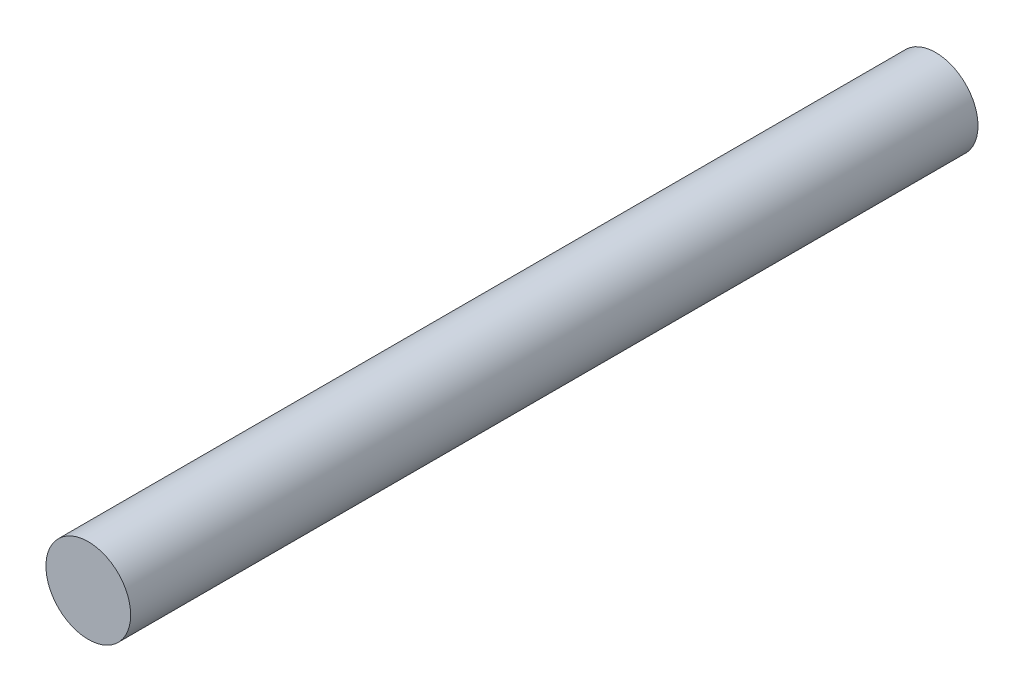
ISO-10303-21;
HEADER;
FILE_DESCRIPTION(('STEP AP214'),'2;1');
FILE_NAME('part.step','',(''),(''),'','','');
FILE_SCHEMA(('AUTOMOTIVE_DESIGN { 1 0 10303 214 1 1 1 1 }'));
ENDSEC;
DATA;
#1=APPLICATION_CONTEXT('core data for automotive mechanical design processes');
#2=APPLICATION_PROTOCOL_DEFINITION('international standard','automotive_design',2000,#1);
#3=PRODUCT_CONTEXT('',#1,'mechanical');
#4=PRODUCT('Part','Part','',(#3));
#5=PRODUCT_RELATED_PRODUCT_CATEGORY('part','',(#4));
#6=PRODUCT_DEFINITION_FORMATION('','',#4);
#7=PRODUCT_DEFINITION_CONTEXT('part definition',#1,'design');
#8=PRODUCT_DEFINITION('design','',#6,#7);
#9=PRODUCT_DEFINITION_SHAPE('','',#8);
#10=(LENGTH_UNIT() NAMED_UNIT(*) SI_UNIT(.MILLI.,.METRE.));
#11=(NAMED_UNIT(*) PLANE_ANGLE_UNIT() SI_UNIT($,.RADIAN.));
#12=(NAMED_UNIT(*) SI_UNIT($,.STERADIAN.) SOLID_ANGLE_UNIT());
#13=UNCERTAINTY_MEASURE_WITH_UNIT(LENGTH_MEASURE(1.E-05),#10,'distance_accuracy_value','');
#14=(GEOMETRIC_REPRESENTATION_CONTEXT(3) GLOBAL_UNCERTAINTY_ASSIGNED_CONTEXT((#13)) GLOBAL_UNIT_ASSIGNED_CONTEXT((#10,
#11,#12)) REPRESENTATION_CONTEXT('',''));
#15=CARTESIAN_POINT('',(0.,0.,0.));
#16=DIRECTION('',(0.,0.,1.));
#17=DIRECTION('',(1.,0.,0.));
#18=AXIS2_PLACEMENT_3D('',#15,#16,#17);
#19=CARTESIAN_POINT('',(0.,0.,50.));
#20=DIRECTION('',(0.,0.,-1.));
#21=DIRECTION('',(-1.,0.,0.));
#22=AXIS2_PLACEMENT_3D('',#19,#20,#21);
#23=CYLINDRICAL_SURFACE('',#22,2.5);
#24=CARTESIAN_POINT('',(0.,0.,50.));
#25=DIRECTION('',(0.,0.,1.));
#26=DIRECTION('',(1.,0.,0.));
#27=AXIS2_PLACEMENT_3D('',#24,#25,#26);
#28=CIRCLE('',#27,2.5);
#29=CARTESIAN_POINT('',(2.5,0.,50.));
#30=VERTEX_POINT('',#29);
#31=EDGE_CURVE('E10',#30,#30,#28,.T.);
#32=ORIENTED_EDGE('',*,*,#31,.F.);
#33=EDGE_LOOP('',(#32));
#34=FACE_BOUND('',#33,.T.);
#35=CARTESIAN_POINT('',(0.,0.,0.));
#36=DIRECTION('',(0.,0.,1.));
#37=DIRECTION('',(1.,0.,0.));
#38=AXIS2_PLACEMENT_3D('',#35,#36,#37);
#39=CIRCLE('',#38,2.5);
#40=CARTESIAN_POINT('',(2.5,0.,0.));
#41=VERTEX_POINT('',#40);
#42=EDGE_CURVE('E33',#41,#41,#39,.T.);
#43=ORIENTED_EDGE('',*,*,#42,.T.);
#44=EDGE_LOOP('',(#43));
#45=FACE_BOUND('',#44,.T.);
#46=ADVANCED_FACE('F30',(#34,#45),#23,.T.);
#47=CARTESIAN_POINT('',(0.,0.,50.));
#48=DIRECTION('',(0.,0.,1.));
#49=DIRECTION('',(1.,0.,0.));
#50=AXIS2_PLACEMENT_3D('',#47,#48,#49);
#51=PLANE('',#50);
#52=ORIENTED_EDGE('',*,*,#31,.T.);
#53=EDGE_LOOP('',(#52));
#54=FACE_BOUND('',#53,.T.);
#55=ADVANCED_FACE('F45',(#54),#51,.T.);
#56=CARTESIAN_POINT('',(0.,0.,0.));
#57=DIRECTION('',(0.,0.,1.));
#58=DIRECTION('',(1.,0.,0.));
#59=AXIS2_PLACEMENT_3D('',#56,#57,#58);
#60=PLANE('',#59);
#61=ORIENTED_EDGE('',*,*,#42,.F.);
#62=EDGE_LOOP('',(#61));
#63=FACE_BOUND('',#62,.T.);
#64=ADVANCED_FACE('F43',(#63),#60,.F.);
#65=CLOSED_SHELL('',(#46,#55,#64));
#66=MANIFOLD_SOLID_BREP('B2',#65);
#67=ADVANCED_BREP_SHAPE_REPRESENTATION('',(#18,#66),#14);
#68=SHAPE_DEFINITION_REPRESENTATION(#9,#67);
ENDSEC;
END-ISO-10303-21;
